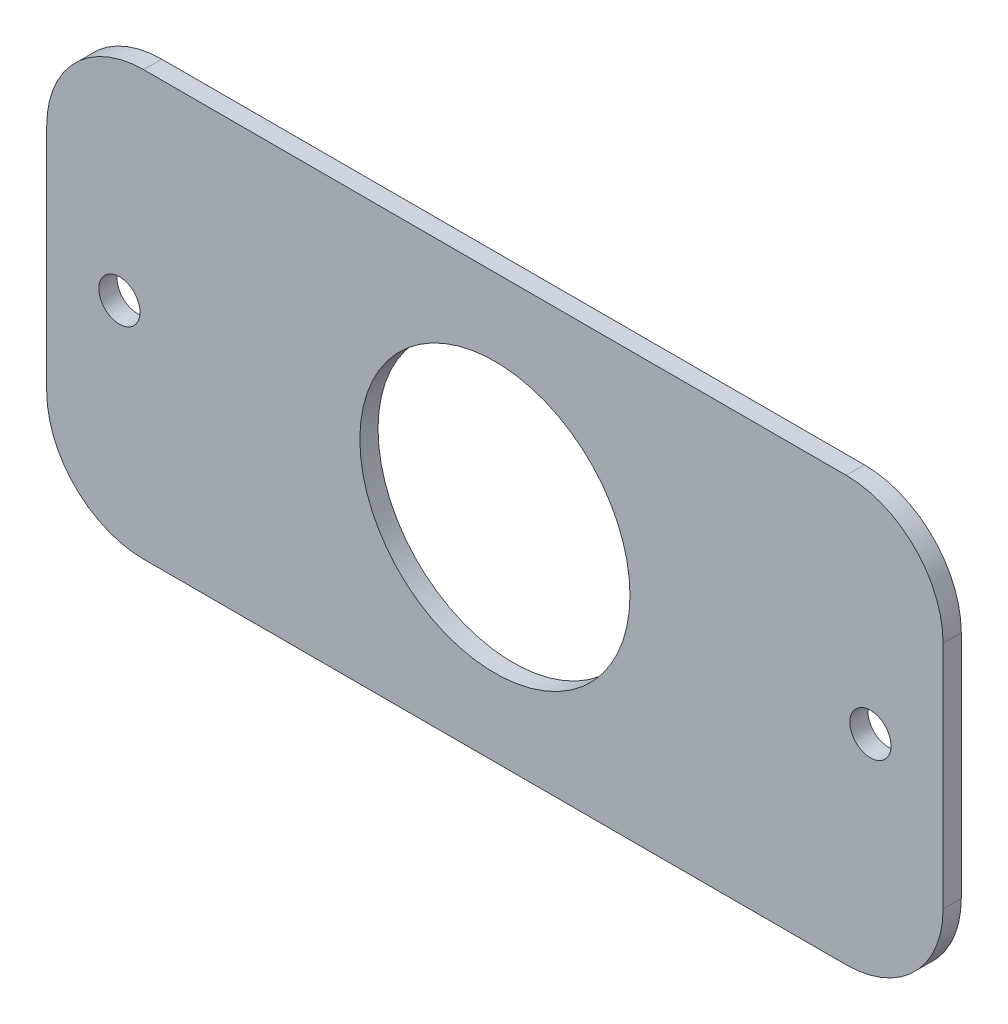
ISO-10303-21;
HEADER;
FILE_DESCRIPTION(('STEP AP214'),'2;1');
FILE_NAME('part.step','',(''),(''),'','','');
FILE_SCHEMA(('AUTOMOTIVE_DESIGN { 1 0 10303 214 1 1 1 1 }'));
ENDSEC;
DATA;
#1=APPLICATION_CONTEXT('core data for automotive mechanical design processes');
#2=APPLICATION_PROTOCOL_DEFINITION('international standard','automotive_design',2000,#1);
#3=PRODUCT_CONTEXT('',#1,'mechanical');
#4=PRODUCT('Part','Part','',(#3));
#5=PRODUCT_RELATED_PRODUCT_CATEGORY('part','',(#4));
#6=PRODUCT_DEFINITION_FORMATION('','',#4);
#7=PRODUCT_DEFINITION_CONTEXT('part definition',#1,'design');
#8=PRODUCT_DEFINITION('design','',#6,#7);
#9=PRODUCT_DEFINITION_SHAPE('','',#8);
#10=(LENGTH_UNIT() NAMED_UNIT(*) SI_UNIT(.MILLI.,.METRE.));
#11=(NAMED_UNIT(*) PLANE_ANGLE_UNIT() SI_UNIT($,.RADIAN.));
#12=(NAMED_UNIT(*) SI_UNIT($,.STERADIAN.) SOLID_ANGLE_UNIT());
#13=UNCERTAINTY_MEASURE_WITH_UNIT(LENGTH_MEASURE(1.E-05),#10,'distance_accuracy_value','');
#14=(GEOMETRIC_REPRESENTATION_CONTEXT(3) GLOBAL_UNCERTAINTY_ASSIGNED_CONTEXT((#13)) GLOBAL_UNIT_ASSIGNED_CONTEXT((#10,
#11,#12)) REPRESENTATION_CONTEXT('',''));
#15=CARTESIAN_POINT('',(0.,0.,0.));
#16=DIRECTION('',(0.,0.,1.));
#17=DIRECTION('',(1.,0.,0.));
#18=AXIS2_PLACEMENT_3D('',#15,#16,#17);
#19=CARTESIAN_POINT('',(0.,0.,1.5));
#20=DIRECTION('',(0.,0.,-1.));
#21=DIRECTION('',(-1.,0.,0.));
#22=AXIS2_PLACEMENT_3D('',#19,#20,#21);
#23=PLANE('',#22);
#24=CARTESIAN_POINT('',(6.,17.5,1.5));
#25=DIRECTION('',(0.,0.,1.));
#26=DIRECTION('',(1.,0.,0.));
#27=AXIS2_PLACEMENT_3D('',#24,#25,#26);
#28=CIRCLE('',#27,1.69999999999999);
#29=CARTESIAN_POINT('',(7.69999999999999,17.5,1.5));
#30=VERTEX_POINT('',#29);
#31=EDGE_CURVE('E226',#30,#30,#28,.T.);
#32=ORIENTED_EDGE('',*,*,#31,.F.);
#33=EDGE_LOOP('',(#32));
#34=FACE_BOUND('',#33,.T.);
#35=CARTESIAN_POINT('',(68.,17.5,1.5));
#36=DIRECTION('',(0.,0.,1.));
#37=DIRECTION('',(1.,0.,0.));
#38=AXIS2_PLACEMENT_3D('',#35,#36,#37);
#39=CIRCLE('',#38,1.69999999999999);
#40=CARTESIAN_POINT('',(69.7,17.5,1.5));
#41=VERTEX_POINT('',#40);
#42=EDGE_CURVE('E218',#41,#41,#39,.T.);
#43=ORIENTED_EDGE('',*,*,#42,.F.);
#44=EDGE_LOOP('',(#43));
#45=FACE_BOUND('',#44,.T.);
#46=DIRECTION('',(-1.,0.,0.));
#47=VECTOR('',#46,1.);
#48=CARTESIAN_POINT('',(0.,35.,1.5));
#49=LINE('',#48,#47);
#50=CARTESIAN_POINT('',(66.,35.,1.5));
#51=VERTEX_POINT('',#50);
#52=CARTESIAN_POINT('',(8.,35.,1.5));
#53=VERTEX_POINT('',#52);
#54=EDGE_CURVE('E148',#51,#53,#49,.T.);
#55=ORIENTED_EDGE('',*,*,#54,.T.);
#56=CARTESIAN_POINT('',(8.,27.,1.5));
#57=DIRECTION('',(0.,0.,-1.));
#58=DIRECTION('',(-1.,0.,0.));
#59=AXIS2_PLACEMENT_3D('',#56,#57,#58);
#60=CIRCLE('',#59,8.);
#61=CARTESIAN_POINT('',(0.,27.,1.5));
#62=VERTEX_POINT('',#61);
#63=EDGE_CURVE('E178',#53,#62,#60,.F.);
#64=ORIENTED_EDGE('',*,*,#63,.T.);
#65=DIRECTION('',(0.,-1.,0.));
#66=VECTOR('',#65,1.);
#67=CARTESIAN_POINT('',(0.,0.,1.5));
#68=LINE('',#67,#66);
#69=CARTESIAN_POINT('',(0.,8.,1.5));
#70=VERTEX_POINT('',#69);
#71=EDGE_CURVE('E127',#62,#70,#68,.T.);
#72=ORIENTED_EDGE('',*,*,#71,.T.);
#73=CARTESIAN_POINT('',(8.,8.,1.5));
#74=DIRECTION('',(0.,0.,-1.));
#75=DIRECTION('',(-1.,0.,0.));
#76=AXIS2_PLACEMENT_3D('',#73,#74,#75);
#77=CIRCLE('',#76,8.);
#78=CARTESIAN_POINT('',(8.,0.,1.5));
#79=VERTEX_POINT('',#78);
#80=EDGE_CURVE('E170',#70,#79,#77,.F.);
#81=ORIENTED_EDGE('',*,*,#80,.T.);
#82=DIRECTION('',(1.,0.,0.));
#83=VECTOR('',#82,1.);
#84=CARTESIAN_POINT('',(0.,0.,1.5));
#85=LINE('',#84,#83);
#86=CARTESIAN_POINT('',(66.,0.,1.5));
#87=VERTEX_POINT('',#86);
#88=EDGE_CURVE('E193',#79,#87,#85,.T.);
#89=ORIENTED_EDGE('',*,*,#88,.T.);
#90=CARTESIAN_POINT('',(66.,8.,1.5));
#91=DIRECTION('',(0.,0.,-1.));
#92=DIRECTION('',(-1.,0.,0.));
#93=AXIS2_PLACEMENT_3D('',#90,#91,#92);
#94=CIRCLE('',#93,8.);
#95=CARTESIAN_POINT('',(74.,8.,1.5));
#96=VERTEX_POINT('',#95);
#97=EDGE_CURVE('E62',#87,#96,#94,.F.);
#98=ORIENTED_EDGE('',*,*,#97,.T.);
#99=DIRECTION('',(0.,1.,0.));
#100=VECTOR('',#99,1.);
#101=CARTESIAN_POINT('',(74.,0.,1.5));
#102=LINE('',#101,#100);
#103=CARTESIAN_POINT('',(74.,27.,1.5));
#104=VERTEX_POINT('',#103);
#105=EDGE_CURVE('E201',#96,#104,#102,.T.);
#106=ORIENTED_EDGE('',*,*,#105,.T.);
#107=CARTESIAN_POINT('',(66.,27.,1.5));
#108=DIRECTION('',(0.,0.,-1.));
#109=DIRECTION('',(-1.,0.,0.));
#110=AXIS2_PLACEMENT_3D('',#107,#108,#109);
#111=CIRCLE('',#110,8.);
#112=EDGE_CURVE('E175',#104,#51,#111,.F.);
#113=ORIENTED_EDGE('',*,*,#112,.T.);
#114=EDGE_LOOP('',(#55,#64,#72,#81,#89,#98,#106,#113));
#115=FACE_BOUND('',#114,.T.);
#116=CARTESIAN_POINT('',(37.,17.5,1.5));
#117=DIRECTION('',(0.,0.,1.));
#118=DIRECTION('',(1.,0.,0.));
#119=AXIS2_PLACEMENT_3D('',#116,#117,#118);
#120=CIRCLE('',#119,11.15);
#121=CARTESIAN_POINT('',(48.15,17.5,1.5));
#122=VERTEX_POINT('',#121);
#123=EDGE_CURVE('E137',#122,#122,#120,.T.);
#124=ORIENTED_EDGE('',*,*,#123,.F.);
#125=EDGE_LOOP('',(#124));
#126=FACE_BOUND('',#125,.T.);
#127=ADVANCED_FACE('F39',(#34,#45,#115,#126),#23,.F.);
#128=CARTESIAN_POINT('',(0.,0.,0.));
#129=DIRECTION('',(0.,0.,-1.));
#130=DIRECTION('',(-1.,0.,0.));
#131=AXIS2_PLACEMENT_3D('',#128,#129,#130);
#132=PLANE('',#131);
#133=CARTESIAN_POINT('',(6.,17.5,0.));
#134=DIRECTION('',(0.,0.,1.));
#135=DIRECTION('',(1.,0.,0.));
#136=AXIS2_PLACEMENT_3D('',#133,#134,#135);
#137=CIRCLE('',#136,1.7);
#138=CARTESIAN_POINT('',(7.7,17.5,0.));
#139=VERTEX_POINT('',#138);
#140=EDGE_CURVE('E222',#139,#139,#137,.T.);
#141=ORIENTED_EDGE('',*,*,#140,.T.);
#142=EDGE_LOOP('',(#141));
#143=FACE_BOUND('',#142,.T.);
#144=CARTESIAN_POINT('',(68.,17.5,0.));
#145=DIRECTION('',(0.,0.,1.));
#146=DIRECTION('',(1.,0.,0.));
#147=AXIS2_PLACEMENT_3D('',#144,#145,#146);
#148=CIRCLE('',#147,1.69999999999999);
#149=CARTESIAN_POINT('',(69.7,17.5,0.));
#150=VERTEX_POINT('',#149);
#151=EDGE_CURVE('E213',#150,#150,#148,.T.);
#152=ORIENTED_EDGE('',*,*,#151,.T.);
#153=EDGE_LOOP('',(#152));
#154=FACE_BOUND('',#153,.T.);
#155=DIRECTION('',(0.,-1.,0.));
#156=VECTOR('',#155,1.);
#157=CARTESIAN_POINT('',(0.,0.,0.));
#158=LINE('',#157,#156);
#159=CARTESIAN_POINT('',(0.,27.,0.));
#160=VERTEX_POINT('',#159);
#161=CARTESIAN_POINT('',(0.,8.,0.));
#162=VERTEX_POINT('',#161);
#163=EDGE_CURVE('E124',#160,#162,#158,.T.);
#164=ORIENTED_EDGE('',*,*,#163,.F.);
#165=CARTESIAN_POINT('',(8.,27.,0.));
#166=DIRECTION('',(0.,0.,-1.));
#167=DIRECTION('',(-1.,0.,0.));
#168=AXIS2_PLACEMENT_3D('',#165,#166,#167);
#169=CIRCLE('',#168,8.);
#170=CARTESIAN_POINT('',(8.,35.,0.));
#171=VERTEX_POINT('',#170);
#172=EDGE_CURVE('E106',#160,#171,#169,.T.);
#173=ORIENTED_EDGE('',*,*,#172,.T.);
#174=DIRECTION('',(-1.,0.,0.));
#175=VECTOR('',#174,1.);
#176=CARTESIAN_POINT('',(0.,35.,0.));
#177=LINE('',#176,#175);
#178=CARTESIAN_POINT('',(66.,35.,0.));
#179=VERTEX_POINT('',#178);
#180=EDGE_CURVE('E153',#179,#171,#177,.T.);
#181=ORIENTED_EDGE('',*,*,#180,.F.);
#182=CARTESIAN_POINT('',(66.,27.,0.));
#183=DIRECTION('',(0.,0.,-1.));
#184=DIRECTION('',(-1.,0.,0.));
#185=AXIS2_PLACEMENT_3D('',#182,#183,#184);
#186=CIRCLE('',#185,8.);
#187=CARTESIAN_POINT('',(74.,27.,0.));
#188=VERTEX_POINT('',#187);
#189=EDGE_CURVE('E118',#179,#188,#186,.T.);
#190=ORIENTED_EDGE('',*,*,#189,.T.);
#191=DIRECTION('',(0.,1.,0.));
#192=VECTOR('',#191,1.);
#193=CARTESIAN_POINT('',(74.,0.,0.));
#194=LINE('',#193,#192);
#195=CARTESIAN_POINT('',(74.,8.,0.));
#196=VERTEX_POINT('',#195);
#197=EDGE_CURVE('E142',#196,#188,#194,.T.);
#198=ORIENTED_EDGE('',*,*,#197,.F.);
#199=CARTESIAN_POINT('',(66.,8.,0.));
#200=DIRECTION('',(0.,0.,-1.));
#201=DIRECTION('',(-1.,0.,0.));
#202=AXIS2_PLACEMENT_3D('',#199,#200,#201);
#203=CIRCLE('',#202,8.);
#204=CARTESIAN_POINT('',(66.,0.,0.));
#205=VERTEX_POINT('',#204);
#206=EDGE_CURVE('E160',#196,#205,#203,.T.);
#207=ORIENTED_EDGE('',*,*,#206,.T.);
#208=DIRECTION('',(1.,0.,0.));
#209=VECTOR('',#208,1.);
#210=CARTESIAN_POINT('',(0.,0.,0.));
#211=LINE('',#210,#209);
#212=CARTESIAN_POINT('',(8.,0.,0.));
#213=VERTEX_POINT('',#212);
#214=EDGE_CURVE('E136',#213,#205,#211,.T.);
#215=ORIENTED_EDGE('',*,*,#214,.F.);
#216=CARTESIAN_POINT('',(8.,8.,0.));
#217=DIRECTION('',(0.,0.,-1.));
#218=DIRECTION('',(-1.,0.,0.));
#219=AXIS2_PLACEMENT_3D('',#216,#217,#218);
#220=CIRCLE('',#219,8.);
#221=EDGE_CURVE('E129',#213,#162,#220,.T.);
#222=ORIENTED_EDGE('',*,*,#221,.T.);
#223=EDGE_LOOP('',(#164,#173,#181,#190,#198,#207,#215,#222));
#224=FACE_BOUND('',#223,.T.);
#225=CARTESIAN_POINT('',(37.,17.5,0.));
#226=DIRECTION('',(0.,0.,1.));
#227=DIRECTION('',(1.,0.,0.));
#228=AXIS2_PLACEMENT_3D('',#225,#226,#227);
#229=CIRCLE('',#228,11.15);
#230=CARTESIAN_POINT('',(48.15,17.5,0.));
#231=VERTEX_POINT('',#230);
#232=EDGE_CURVE('E145',#231,#231,#229,.T.);
#233=ORIENTED_EDGE('',*,*,#232,.T.);
#234=EDGE_LOOP('',(#233));
#235=FACE_BOUND('',#234,.T.);
#236=ADVANCED_FACE('F132',(#143,#154,#224,#235),#132,.T.);
#237=CARTESIAN_POINT('',(0.,0.,1.5));
#238=DIRECTION('',(1.,0.,0.));
#239=DIRECTION('',(0.,0.,-1.));
#240=AXIS2_PLACEMENT_3D('',#237,#238,#239);
#241=PLANE('',#240);
#242=ORIENTED_EDGE('',*,*,#71,.F.);
#243=DIRECTION('',(0.,0.,-1.));
#244=VECTOR('',#243,1.);
#245=CARTESIAN_POINT('',(0.,27.,1.5));
#246=LINE('',#245,#244);
#247=EDGE_CURVE('E110',#62,#160,#246,.T.);
#248=ORIENTED_EDGE('',*,*,#247,.T.);
#249=ORIENTED_EDGE('',*,*,#163,.T.);
#250=DIRECTION('',(0.,0.,-1.));
#251=VECTOR('',#250,1.);
#252=CARTESIAN_POINT('',(0.,8.,1.5));
#253=LINE('',#252,#251);
#254=EDGE_CURVE('E130',#162,#70,#253,.F.);
#255=ORIENTED_EDGE('',*,*,#254,.T.);
#256=EDGE_LOOP('',(#242,#248,#249,#255));
#257=FACE_BOUND('',#256,.T.);
#258=ADVANCED_FACE('F123',(#257),#241,.F.);
#259=CARTESIAN_POINT('',(0.,0.,1.5));
#260=DIRECTION('',(0.,1.,0.));
#261=DIRECTION('',(0.,0.,1.));
#262=AXIS2_PLACEMENT_3D('',#259,#260,#261);
#263=PLANE('',#262);
#264=ORIENTED_EDGE('',*,*,#214,.T.);
#265=DIRECTION('',(0.,0.,-1.));
#266=VECTOR('',#265,1.);
#267=CARTESIAN_POINT('',(66.,0.,1.5));
#268=LINE('',#267,#266);
#269=EDGE_CURVE('E11',#205,#87,#268,.F.);
#270=ORIENTED_EDGE('',*,*,#269,.T.);
#271=ORIENTED_EDGE('',*,*,#88,.F.);
#272=DIRECTION('',(0.,0.,-1.));
#273=VECTOR('',#272,1.);
#274=CARTESIAN_POINT('',(8.,0.,1.5));
#275=LINE('',#274,#273);
#276=EDGE_CURVE('E48',#79,#213,#275,.T.);
#277=ORIENTED_EDGE('',*,*,#276,.T.);
#278=EDGE_LOOP('',(#264,#270,#271,#277));
#279=FACE_BOUND('',#278,.T.);
#280=ADVANCED_FACE('F191',(#279),#263,.F.);
#281=CARTESIAN_POINT('',(74.,0.,1.5));
#282=DIRECTION('',(-1.,0.,0.));
#283=DIRECTION('',(0.,0.,1.));
#284=AXIS2_PLACEMENT_3D('',#281,#282,#283);
#285=PLANE('',#284);
#286=ORIENTED_EDGE('',*,*,#197,.T.);
#287=DIRECTION('',(0.,0.,-1.));
#288=VECTOR('',#287,1.);
#289=CARTESIAN_POINT('',(74.,27.,1.5));
#290=LINE('',#289,#288);
#291=EDGE_CURVE('E55',#188,#104,#290,.F.);
#292=ORIENTED_EDGE('',*,*,#291,.T.);
#293=ORIENTED_EDGE('',*,*,#105,.F.);
#294=DIRECTION('',(0.,0.,-1.));
#295=VECTOR('',#294,1.);
#296=CARTESIAN_POINT('',(74.,8.,1.5));
#297=LINE('',#296,#295);
#298=EDGE_CURVE('E181',#96,#196,#297,.T.);
#299=ORIENTED_EDGE('',*,*,#298,.T.);
#300=EDGE_LOOP('',(#286,#292,#293,#299));
#301=FACE_BOUND('',#300,.T.);
#302=ADVANCED_FACE('F200',(#301),#285,.F.);
#303=CARTESIAN_POINT('',(0.,35.,1.5));
#304=DIRECTION('',(0.,-1.,0.));
#305=DIRECTION('',(0.,0.,-1.));
#306=AXIS2_PLACEMENT_3D('',#303,#304,#305);
#307=PLANE('',#306);
#308=ORIENTED_EDGE('',*,*,#180,.T.);
#309=DIRECTION('',(0.,0.,-1.));
#310=VECTOR('',#309,1.);
#311=CARTESIAN_POINT('',(8.,35.,1.5));
#312=LINE('',#311,#310);
#313=EDGE_CURVE('E111',#171,#53,#312,.F.);
#314=ORIENTED_EDGE('',*,*,#313,.T.);
#315=ORIENTED_EDGE('',*,*,#54,.F.);
#316=DIRECTION('',(0.,0.,-1.));
#317=VECTOR('',#316,1.);
#318=CARTESIAN_POINT('',(66.,35.,1.5));
#319=LINE('',#318,#317);
#320=EDGE_CURVE('E117',#51,#179,#319,.T.);
#321=ORIENTED_EDGE('',*,*,#320,.T.);
#322=EDGE_LOOP('',(#308,#314,#315,#321));
#323=FACE_BOUND('',#322,.T.);
#324=ADVANCED_FACE('F245',(#323),#307,.F.);
#325=CARTESIAN_POINT('',(37.,17.5,1.5));
#326=DIRECTION('',(0.,0.,-1.));
#327=DIRECTION('',(-1.,0.,0.));
#328=AXIS2_PLACEMENT_3D('',#325,#326,#327);
#329=CYLINDRICAL_SURFACE('',#328,11.15);
#330=ORIENTED_EDGE('',*,*,#123,.T.);
#331=EDGE_LOOP('',(#330));
#332=FACE_BOUND('',#331,.T.);
#333=ORIENTED_EDGE('',*,*,#232,.F.);
#334=EDGE_LOOP('',(#333));
#335=FACE_BOUND('',#334,.T.);
#336=ADVANCED_FACE('F241',(#332,#335),#329,.F.);
#337=CARTESIAN_POINT('',(68.,17.5,1.5));
#338=DIRECTION('',(0.,0.,1.));
#339=DIRECTION('',(1.,0.,0.));
#340=AXIS2_PLACEMENT_3D('',#337,#338,#339);
#341=CYLINDRICAL_SURFACE('',#340,1.69999999999999);
#342=ORIENTED_EDGE('',*,*,#151,.F.);
#343=EDGE_LOOP('',(#342));
#344=FACE_BOUND('',#343,.T.);
#345=ORIENTED_EDGE('',*,*,#42,.T.);
#346=EDGE_LOOP('',(#345));
#347=FACE_BOUND('',#346,.T.);
#348=ADVANCED_FACE('F244',(#344,#347),#341,.F.);
#349=CARTESIAN_POINT('',(6.,17.5,1.5));
#350=DIRECTION('',(0.,0.,1.));
#351=DIRECTION('',(1.,0.,0.));
#352=AXIS2_PLACEMENT_3D('',#349,#350,#351);
#353=CYLINDRICAL_SURFACE('',#352,1.69999999999999);
#354=ORIENTED_EDGE('',*,*,#140,.F.);
#355=EDGE_LOOP('',(#354));
#356=FACE_BOUND('',#355,.T.);
#357=ORIENTED_EDGE('',*,*,#31,.T.);
#358=EDGE_LOOP('',(#357));
#359=FACE_BOUND('',#358,.T.);
#360=ADVANCED_FACE('F231',(#356,#359),#353,.F.);
#361=CARTESIAN_POINT('',(8.,27.,1.5));
#362=DIRECTION('',(0.,0.,-1.));
#363=DIRECTION('',(-1.,0.,0.));
#364=AXIS2_PLACEMENT_3D('',#361,#362,#363);
#365=CYLINDRICAL_SURFACE('',#364,8.);
#366=ORIENTED_EDGE('',*,*,#63,.F.);
#367=ORIENTED_EDGE('',*,*,#313,.F.);
#368=ORIENTED_EDGE('',*,*,#172,.F.);
#369=ORIENTED_EDGE('',*,*,#247,.F.);
#370=EDGE_LOOP('',(#366,#367,#368,#369));
#371=FACE_BOUND('',#370,.T.);
#372=ADVANCED_FACE('F109',(#371),#365,.T.);
#373=CARTESIAN_POINT('',(66.,27.,1.5));
#374=DIRECTION('',(0.,0.,-1.));
#375=DIRECTION('',(-1.,0.,0.));
#376=AXIS2_PLACEMENT_3D('',#373,#374,#375);
#377=CYLINDRICAL_SURFACE('',#376,8.);
#378=ORIENTED_EDGE('',*,*,#112,.F.);
#379=ORIENTED_EDGE('',*,*,#291,.F.);
#380=ORIENTED_EDGE('',*,*,#189,.F.);
#381=ORIENTED_EDGE('',*,*,#320,.F.);
#382=EDGE_LOOP('',(#378,#379,#380,#381));
#383=FACE_BOUND('',#382,.T.);
#384=ADVANCED_FACE('F266',(#383),#377,.T.);
#385=CARTESIAN_POINT('',(66.,8.,1.5));
#386=DIRECTION('',(0.,0.,-1.));
#387=DIRECTION('',(-1.,0.,0.));
#388=AXIS2_PLACEMENT_3D('',#385,#386,#387);
#389=CYLINDRICAL_SURFACE('',#388,8.);
#390=ORIENTED_EDGE('',*,*,#97,.F.);
#391=ORIENTED_EDGE('',*,*,#269,.F.);
#392=ORIENTED_EDGE('',*,*,#206,.F.);
#393=ORIENTED_EDGE('',*,*,#298,.F.);
#394=EDGE_LOOP('',(#390,#391,#392,#393));
#395=FACE_BOUND('',#394,.T.);
#396=ADVANCED_FACE('F199',(#395),#389,.T.);
#397=CARTESIAN_POINT('',(8.,8.,1.5));
#398=DIRECTION('',(0.,0.,-1.));
#399=DIRECTION('',(-1.,0.,0.));
#400=AXIS2_PLACEMENT_3D('',#397,#398,#399);
#401=CYLINDRICAL_SURFACE('',#400,8.);
#402=ORIENTED_EDGE('',*,*,#80,.F.);
#403=ORIENTED_EDGE('',*,*,#254,.F.);
#404=ORIENTED_EDGE('',*,*,#221,.F.);
#405=ORIENTED_EDGE('',*,*,#276,.F.);
#406=EDGE_LOOP('',(#402,#403,#404,#405));
#407=FACE_BOUND('',#406,.T.);
#408=ADVANCED_FACE('F41',(#407),#401,.T.);
#409=CLOSED_SHELL('',(#127,#236,#258,#280,#302,#324,#336,#348,#360,#372,#384,#396,#408));
#410=MANIFOLD_SOLID_BREP('B2',#409);
#411=ADVANCED_BREP_SHAPE_REPRESENTATION('',(#18,#410),#14);
#412=SHAPE_DEFINITION_REPRESENTATION(#9,#411);
ENDSEC;
END-ISO-10303-21;
